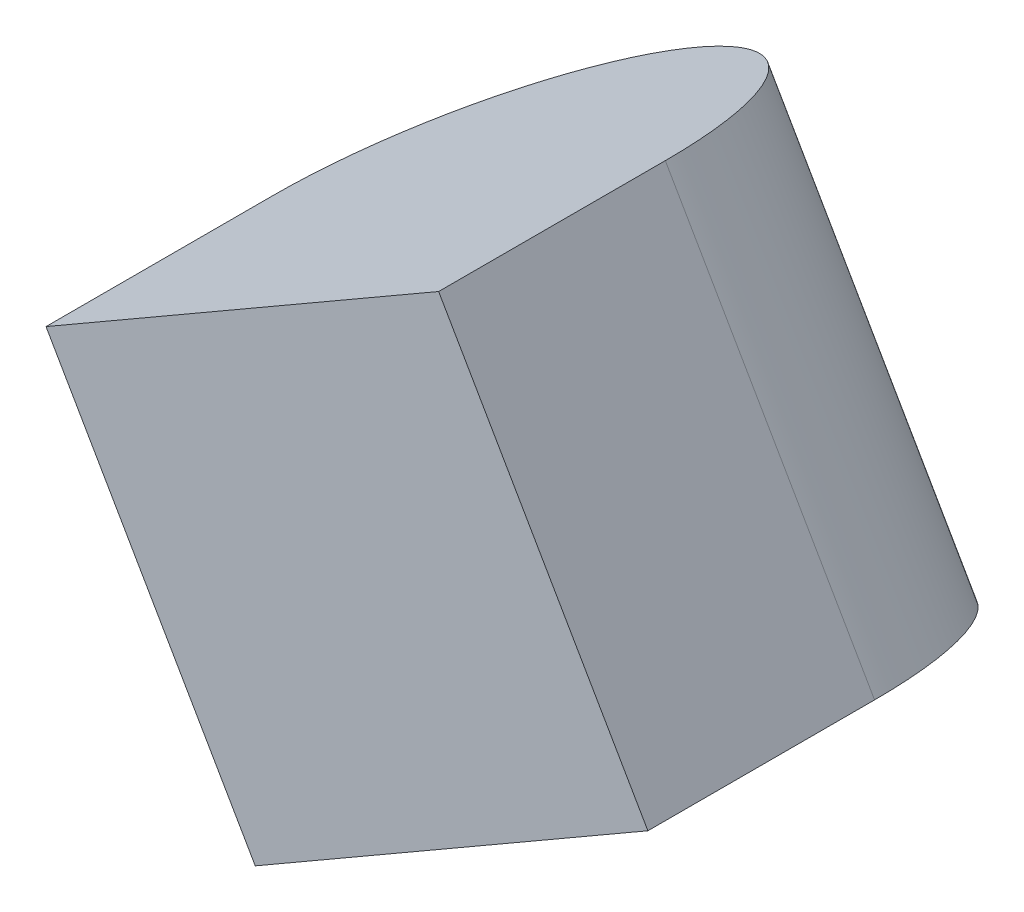
ISO-10303-21;
HEADER;
FILE_DESCRIPTION(('STEP AP214'),'2;1');
FILE_NAME('part.step','',(''),(''),'','','');
FILE_SCHEMA(('AUTOMOTIVE_DESIGN { 1 0 10303 214 1 1 1 1 }'));
ENDSEC;
DATA;
#1=APPLICATION_CONTEXT('core data for automotive mechanical design processes');
#2=APPLICATION_PROTOCOL_DEFINITION('international standard','automotive_design',2000,#1);
#3=PRODUCT_CONTEXT('',#1,'mechanical');
#4=PRODUCT('Part','Part','',(#3));
#5=PRODUCT_RELATED_PRODUCT_CATEGORY('part','',(#4));
#6=PRODUCT_DEFINITION_FORMATION('','',#4);
#7=PRODUCT_DEFINITION_CONTEXT('part definition',#1,'design');
#8=PRODUCT_DEFINITION('design','',#6,#7);
#9=PRODUCT_DEFINITION_SHAPE('','',#8);
#10=(LENGTH_UNIT() NAMED_UNIT(*) SI_UNIT(.MILLI.,.METRE.));
#11=(NAMED_UNIT(*) PLANE_ANGLE_UNIT() SI_UNIT($,.RADIAN.));
#12=(NAMED_UNIT(*) SI_UNIT($,.STERADIAN.) SOLID_ANGLE_UNIT());
#13=UNCERTAINTY_MEASURE_WITH_UNIT(LENGTH_MEASURE(1.E-05),#10,'distance_accuracy_value','');
#14=(GEOMETRIC_REPRESENTATION_CONTEXT(3) GLOBAL_UNCERTAINTY_ASSIGNED_CONTEXT((#13)) GLOBAL_UNIT_ASSIGNED_CONTEXT((#10,
#11,#12)) REPRESENTATION_CONTEXT('',''));
#15=CARTESIAN_POINT('',(0.,0.,0.));
#16=DIRECTION('',(0.,0.,1.));
#17=DIRECTION('',(1.,0.,0.));
#18=AXIS2_PLACEMENT_3D('',#15,#16,#17);
#19=CARTESIAN_POINT('',(-46.3478700807587,-69.4934308064442,33.5324663585261));
#20=DIRECTION('',(0.,0.,1.));
#21=DIRECTION('',(0.,-1.,0.));
#22=AXIS2_PLACEMENT_3D('',#19,#20,#21);
#23=PLANE('',#22);
#24=DIRECTION('',(-0.866025403784439,-0.5,0.));
#25=VECTOR('',#24,1.);
#26=CARTESIAN_POINT('',(-47.1668979818965,-61.5748328688571,33.5324663585261));
#27=LINE('',#26,#25);
#28=CARTESIAN_POINT('',(-49.9814805441959,-63.1998328688571,33.5324663585261));
#29=VERTEX_POINT('',#28);
#30=CARTESIAN_POINT('',(-44.3523154195971,-59.9498328688571,33.5324663585261));
#31=VERTEX_POINT('',#30);
#32=EDGE_CURVE('E51',#29,#31,#27,.F.);
#33=ORIENTED_EDGE('',*,*,#32,.T.);
#34=DIRECTION('',(-0.5,0.866025403784439,0.));
#35=VECTOR('',#34,1.);
#36=CARTESIAN_POINT('',(-40.7187049561599,-66.2434308064442,33.5324663585261));
#37=LINE('',#36,#35);
#38=CARTESIAN_POINT('',(-47.352315419597,-54.7536804461505,33.5324663585261));
#39=VERTEX_POINT('',#38);
#40=EDGE_CURVE('E70',#39,#31,#37,.F.);
#41=ORIENTED_EDGE('',*,*,#40,.F.);
#42=DIRECTION('',(-0.866025403784439,-0.5,0.));
#43=VECTOR('',#42,1.);
#44=CARTESIAN_POINT('',(-50.1668979818965,-56.3786804461505,33.5324663585261));
#45=LINE('',#44,#43);
#46=CARTESIAN_POINT('',(-52.9814805441959,-58.0036804461505,33.5324663585261));
#47=VERTEX_POINT('',#46);
#48=EDGE_CURVE('E59',#47,#39,#45,.F.);
#49=ORIENTED_EDGE('',*,*,#48,.F.);
#50=DIRECTION('',(0.5,-0.866025403784439,0.));
#51=VECTOR('',#50,1.);
#52=CARTESIAN_POINT('',(-46.3478700807587,-69.4934308064442,33.5324663585261));
#53=LINE('',#52,#51);
#54=EDGE_CURVE('E90',#29,#47,#53,.F.);
#55=ORIENTED_EDGE('',*,*,#54,.F.);
#56=EDGE_LOOP('',(#33,#41,#49,#55));
#57=FACE_BOUND('',#56,.T.);
#58=ADVANCED_FACE('F16',(#57),#23,.T.);
#59=CARTESIAN_POINT('',(-50.1668979818965,-56.3786804461505,30.2824663585261));
#60=DIRECTION('',(-0.5,0.866025403784439,0.));
#61=DIRECTION('',(-0.866025403784439,-0.5,0.));
#62=AXIS2_PLACEMENT_3D('',#59,#60,#61);
#63=PLANE('',#62);
#64=CARTESIAN_POINT('',(-50.1668979818965,-56.3786804461505,30.2824663585261));
#65=DIRECTION('',(0.5,-0.866025403784439,0.));
#66=DIRECTION('',(0.866025403784439,0.5,0.));
#67=AXIS2_PLACEMENT_3D('',#64,#65,#66);
#68=CIRCLE('',#67,3.25000000000002);
#69=CARTESIAN_POINT('',(-52.9814805441959,-58.0036804461505,30.2824663585261));
#70=VERTEX_POINT('',#69);
#71=CARTESIAN_POINT('',(-47.352315419597,-54.7536804461505,30.2824663585261));
#72=VERTEX_POINT('',#71);
#73=EDGE_CURVE('E19',#70,#72,#68,.T.);
#74=ORIENTED_EDGE('',*,*,#73,.F.);
#75=DIRECTION('',(0.,0.,1.));
#76=VECTOR('',#75,1.);
#77=CARTESIAN_POINT('',(-52.9814805441959,-58.0036804461505,30.2824663585261));
#78=LINE('',#77,#76);
#79=EDGE_CURVE('E65',#47,#70,#78,.F.);
#80=ORIENTED_EDGE('',*,*,#79,.F.);
#81=ORIENTED_EDGE('',*,*,#48,.T.);
#82=DIRECTION('',(0.,0.,1.));
#83=VECTOR('',#82,1.);
#84=CARTESIAN_POINT('',(-47.352315419597,-54.7536804461505,30.2824663585261));
#85=LINE('',#84,#83);
#86=EDGE_CURVE('E63',#72,#39,#85,.T.);
#87=ORIENTED_EDGE('',*,*,#86,.F.);
#88=EDGE_LOOP('',(#74,#80,#81,#87));
#89=FACE_BOUND('',#88,.T.);
#90=ADVANCED_FACE('F61',(#89),#63,.T.);
#91=CARTESIAN_POINT('',(-40.7187049561599,-66.2434308064442,30.2824663585261));
#92=DIRECTION('',(0.866025403784439,0.5,0.));
#93=DIRECTION('',(-0.5,0.866025403784439,0.));
#94=AXIS2_PLACEMENT_3D('',#91,#92,#93);
#95=PLANE('',#94);
#96=DIRECTION('',(0.,0.,1.));
#97=VECTOR('',#96,1.);
#98=CARTESIAN_POINT('',(-44.3523154195971,-59.9498328688571,30.2824663585261));
#99=LINE('',#98,#97);
#100=CARTESIAN_POINT('',(-44.3523154195971,-59.9498328688571,30.2824663585261));
#101=VERTEX_POINT('',#100);
#102=EDGE_CURVE('E84',#31,#101,#99,.F.);
#103=ORIENTED_EDGE('',*,*,#102,.T.);
#104=DIRECTION('',(0.5,-0.866025403784439,0.));
#105=VECTOR('',#104,1.);
#106=CARTESIAN_POINT('',(-47.352315419597,-54.7536804461505,30.2824663585261));
#107=LINE('',#106,#105);
#108=EDGE_CURVE('E75',#72,#101,#107,.T.);
#109=ORIENTED_EDGE('',*,*,#108,.F.);
#110=ORIENTED_EDGE('',*,*,#86,.T.);
#111=ORIENTED_EDGE('',*,*,#40,.T.);
#112=EDGE_LOOP('',(#103,#109,#110,#111));
#113=FACE_BOUND('',#112,.T.);
#114=ADVANCED_FACE('F73',(#113),#95,.T.);
#115=CARTESIAN_POINT('',(-47.1668979818965,-61.5748328688571,30.2824663585261));
#116=DIRECTION('',(-0.5,0.866025403784439,0.));
#117=DIRECTION('',(-0.866025403784439,-0.5,0.));
#118=AXIS2_PLACEMENT_3D('',#115,#116,#117);
#119=PLANE('',#118);
#120=ORIENTED_EDGE('',*,*,#32,.F.);
#121=DIRECTION('',(0.,0.,1.));
#122=VECTOR('',#121,1.);
#123=CARTESIAN_POINT('',(-49.9814805441959,-63.1998328688571,30.2824663585261));
#124=LINE('',#123,#122);
#125=CARTESIAN_POINT('',(-49.9814805441959,-63.1998328688571,30.2824663585261));
#126=VERTEX_POINT('',#125);
#127=EDGE_CURVE('E34',#126,#29,#124,.T.);
#128=ORIENTED_EDGE('',*,*,#127,.F.);
#129=CARTESIAN_POINT('',(-47.1668979818965,-61.5748328688571,30.2824663585261));
#130=DIRECTION('',(0.5,-0.866025403784439,0.));
#131=DIRECTION('',(0.866025403784439,0.5,0.));
#132=AXIS2_PLACEMENT_3D('',#129,#130,#131);
#133=CIRCLE('',#132,3.25000000000002);
#134=EDGE_CURVE('E25',#101,#126,#133,.F.);
#135=ORIENTED_EDGE('',*,*,#134,.F.);
#136=ORIENTED_EDGE('',*,*,#102,.F.);
#137=EDGE_LOOP('',(#120,#128,#135,#136));
#138=FACE_BOUND('',#137,.T.);
#139=ADVANCED_FACE('F112',(#138),#119,.F.);
#140=CARTESIAN_POINT('',(-46.3478700807587,-69.4934308064442,30.2824663585261));
#141=DIRECTION('',(-0.866025403784439,-0.5,0.));
#142=DIRECTION('',(0.5,-0.866025403784439,0.));
#143=AXIS2_PLACEMENT_3D('',#140,#141,#142);
#144=PLANE('',#143);
#145=ORIENTED_EDGE('',*,*,#127,.T.);
#146=ORIENTED_EDGE('',*,*,#54,.T.);
#147=ORIENTED_EDGE('',*,*,#79,.T.);
#148=DIRECTION('',(0.5,-0.866025403784439,0.));
#149=VECTOR('',#148,1.);
#150=CARTESIAN_POINT('',(-52.9814805441959,-58.0036804461505,30.2824663585261));
#151=LINE('',#150,#149);
#152=EDGE_CURVE('E10',#126,#70,#151,.F.);
#153=ORIENTED_EDGE('',*,*,#152,.F.);
#154=EDGE_LOOP('',(#145,#146,#147,#153));
#155=FACE_BOUND('',#154,.T.);
#156=ADVANCED_FACE('F104',(#155),#144,.T.);
#157=CARTESIAN_POINT('',(-50.1668979818965,-56.3786804461505,30.2824663585261));
#158=DIRECTION('',(0.5,-0.866025403784439,0.));
#159=DIRECTION('',(0.866025403784439,0.5,0.));
#160=AXIS2_PLACEMENT_3D('',#157,#158,#159);
#161=CYLINDRICAL_SURFACE('',#160,3.25000000000002);
#162=ORIENTED_EDGE('',*,*,#134,.T.);
#163=ORIENTED_EDGE('',*,*,#152,.T.);
#164=ORIENTED_EDGE('',*,*,#73,.T.);
#165=ORIENTED_EDGE('',*,*,#108,.T.);
#166=EDGE_LOOP('',(#162,#163,#164,#165));
#167=FACE_BOUND('',#166,.T.);
#168=ADVANCED_FACE('F105',(#167),#161,.T.);
#169=CLOSED_SHELL('',(#58,#90,#114,#139,#156,#168));
#170=MANIFOLD_SOLID_BREP('B1',#169);
#171=ADVANCED_BREP_SHAPE_REPRESENTATION('',(#18,#170),#14);
#172=SHAPE_DEFINITION_REPRESENTATION(#9,#171);
ENDSEC;
END-ISO-10303-21;
